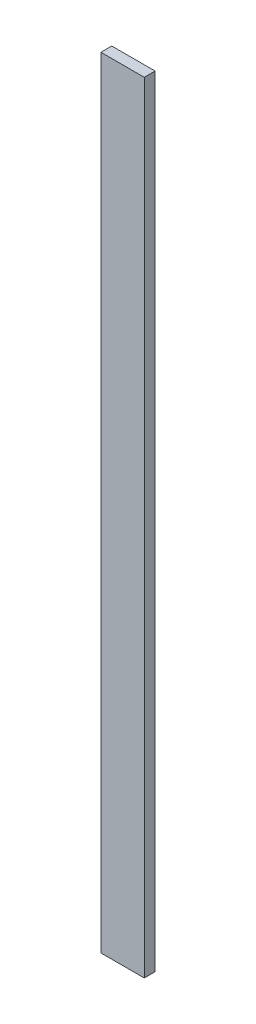
ISO-10303-21;
HEADER;
FILE_DESCRIPTION(('STEP AP214'),'2;1');
FILE_NAME('part.step','',(''),(''),'','','');
FILE_SCHEMA(('AUTOMOTIVE_DESIGN { 1 0 10303 214 1 1 1 1 }'));
ENDSEC;
DATA;
#1=APPLICATION_CONTEXT('core data for automotive mechanical design processes');
#2=APPLICATION_PROTOCOL_DEFINITION('international standard','automotive_design',2000,#1);
#3=PRODUCT_CONTEXT('',#1,'mechanical');
#4=PRODUCT('Part','Part','',(#3));
#5=PRODUCT_RELATED_PRODUCT_CATEGORY('part','',(#4));
#6=PRODUCT_DEFINITION_FORMATION('','',#4);
#7=PRODUCT_DEFINITION_CONTEXT('part definition',#1,'design');
#8=PRODUCT_DEFINITION('design','',#6,#7);
#9=PRODUCT_DEFINITION_SHAPE('','',#8);
#10=(LENGTH_UNIT() NAMED_UNIT(*) SI_UNIT(.MILLI.,.METRE.));
#11=(NAMED_UNIT(*) PLANE_ANGLE_UNIT() SI_UNIT($,.RADIAN.));
#12=(NAMED_UNIT(*) SI_UNIT($,.STERADIAN.) SOLID_ANGLE_UNIT());
#13=UNCERTAINTY_MEASURE_WITH_UNIT(LENGTH_MEASURE(1.E-05),#10,'distance_accuracy_value','');
#14=(GEOMETRIC_REPRESENTATION_CONTEXT(3) GLOBAL_UNCERTAINTY_ASSIGNED_CONTEXT((#13)) GLOBAL_UNIT_ASSIGNED_CONTEXT((#10,
#11,#12)) REPRESENTATION_CONTEXT('',''));
#15=CARTESIAN_POINT('',(0.,0.,0.));
#16=DIRECTION('',(0.,0.,1.));
#17=DIRECTION('',(1.,0.,0.));
#18=AXIS2_PLACEMENT_3D('',#15,#16,#17);
#19=CARTESIAN_POINT('',(12.7,-228.6,6.35));
#20=DIRECTION('',(-1.,0.,0.));
#21=DIRECTION('',(0.,0.,1.));
#22=AXIS2_PLACEMENT_3D('',#19,#20,#21);
#23=PLANE('',#22);
#24=DIRECTION('',(0.,1.,0.));
#25=VECTOR('',#24,1.);
#26=CARTESIAN_POINT('',(12.7,-228.6,0.));
#27=LINE('',#26,#25);
#28=CARTESIAN_POINT('',(12.7,-228.6,0.));
#29=VERTEX_POINT('',#28);
#30=CARTESIAN_POINT('',(12.7,228.6,0.));
#31=VERTEX_POINT('',#30);
#32=EDGE_CURVE('E96',#29,#31,#27,.T.);
#33=ORIENTED_EDGE('',*,*,#32,.T.);
#34=DIRECTION('',(0.,0.,-1.));
#35=VECTOR('',#34,1.);
#36=CARTESIAN_POINT('',(12.7,228.6,6.35));
#37=LINE('',#36,#35);
#38=CARTESIAN_POINT('',(12.7,228.6,6.35));
#39=VERTEX_POINT('',#38);
#40=EDGE_CURVE('E11',#39,#31,#37,.T.);
#41=ORIENTED_EDGE('',*,*,#40,.F.);
#42=DIRECTION('',(0.,1.,0.));
#43=VECTOR('',#42,1.);
#44=CARTESIAN_POINT('',(12.7,-228.6,6.35));
#45=LINE('',#44,#43);
#46=CARTESIAN_POINT('',(12.7,-228.6,6.35));
#47=VERTEX_POINT('',#46);
#48=EDGE_CURVE('E84',#47,#39,#45,.T.);
#49=ORIENTED_EDGE('',*,*,#48,.F.);
#50=DIRECTION('',(0.,0.,-1.));
#51=VECTOR('',#50,1.);
#52=CARTESIAN_POINT('',(12.7,-228.6,6.35));
#53=LINE('',#52,#51);
#54=EDGE_CURVE('E92',#47,#29,#53,.T.);
#55=ORIENTED_EDGE('',*,*,#54,.T.);
#56=EDGE_LOOP('',(#33,#41,#49,#55));
#57=FACE_BOUND('',#56,.T.);
#58=ADVANCED_FACE('F33',(#57),#23,.F.);
#59=CARTESIAN_POINT('',(-12.7,228.6,6.35));
#60=DIRECTION('',(0.,-1.,0.));
#61=DIRECTION('',(0.,0.,-1.));
#62=AXIS2_PLACEMENT_3D('',#59,#60,#61);
#63=PLANE('',#62);
#64=DIRECTION('',(-1.,0.,0.));
#65=VECTOR('',#64,1.);
#66=CARTESIAN_POINT('',(-12.7,228.6,0.));
#67=LINE('',#66,#65);
#68=CARTESIAN_POINT('',(-12.7,228.6,0.));
#69=VERTEX_POINT('',#68);
#70=EDGE_CURVE('E88',#31,#69,#67,.T.);
#71=ORIENTED_EDGE('',*,*,#70,.T.);
#72=DIRECTION('',(0.,0.,-1.));
#73=VECTOR('',#72,1.);
#74=CARTESIAN_POINT('',(-12.7,228.6,6.35));
#75=LINE('',#74,#73);
#76=CARTESIAN_POINT('',(-12.7,228.6,6.35));
#77=VERTEX_POINT('',#76);
#78=EDGE_CURVE('E41',#77,#69,#75,.T.);
#79=ORIENTED_EDGE('',*,*,#78,.F.);
#80=DIRECTION('',(-1.,0.,0.));
#81=VECTOR('',#80,1.);
#82=CARTESIAN_POINT('',(-12.7,228.6,6.35));
#83=LINE('',#82,#81);
#84=EDGE_CURVE('E79',#39,#77,#83,.T.);
#85=ORIENTED_EDGE('',*,*,#84,.F.);
#86=ORIENTED_EDGE('',*,*,#40,.T.);
#87=EDGE_LOOP('',(#71,#79,#85,#86));
#88=FACE_BOUND('',#87,.T.);
#89=ADVANCED_FACE('F87',(#88),#63,.F.);
#90=CARTESIAN_POINT('',(-12.7,-228.6,6.35));
#91=DIRECTION('',(1.,0.,0.));
#92=DIRECTION('',(0.,0.,-1.));
#93=AXIS2_PLACEMENT_3D('',#90,#91,#92);
#94=PLANE('',#93);
#95=DIRECTION('',(0.,-1.,0.));
#96=VECTOR('',#95,1.);
#97=CARTESIAN_POINT('',(-12.7,-228.6,0.));
#98=LINE('',#97,#96);
#99=CARTESIAN_POINT('',(-12.7,-228.6,0.));
#100=VERTEX_POINT('',#99);
#101=EDGE_CURVE('E66',#69,#100,#98,.T.);
#102=ORIENTED_EDGE('',*,*,#101,.T.);
#103=DIRECTION('',(0.,0.,-1.));
#104=VECTOR('',#103,1.);
#105=CARTESIAN_POINT('',(-12.7,-228.6,6.35));
#106=LINE('',#105,#104);
#107=CARTESIAN_POINT('',(-12.7,-228.6,6.35));
#108=VERTEX_POINT('',#107);
#109=EDGE_CURVE('E89',#108,#100,#106,.T.);
#110=ORIENTED_EDGE('',*,*,#109,.F.);
#111=DIRECTION('',(0.,-1.,0.));
#112=VECTOR('',#111,1.);
#113=CARTESIAN_POINT('',(-12.7,-228.6,6.35));
#114=LINE('',#113,#112);
#115=EDGE_CURVE('E82',#77,#108,#114,.T.);
#116=ORIENTED_EDGE('',*,*,#115,.F.);
#117=ORIENTED_EDGE('',*,*,#78,.T.);
#118=EDGE_LOOP('',(#102,#110,#116,#117));
#119=FACE_BOUND('',#118,.T.);
#120=ADVANCED_FACE('F90',(#119),#94,.F.);
#121=CARTESIAN_POINT('',(-12.7,-228.6,6.35));
#122=DIRECTION('',(0.,1.,0.));
#123=DIRECTION('',(0.,0.,1.));
#124=AXIS2_PLACEMENT_3D('',#121,#122,#123);
#125=PLANE('',#124);
#126=DIRECTION('',(1.,0.,0.));
#127=VECTOR('',#126,1.);
#128=CARTESIAN_POINT('',(-12.7,-228.6,0.));
#129=LINE('',#128,#127);
#130=EDGE_CURVE('E72',#100,#29,#129,.T.);
#131=ORIENTED_EDGE('',*,*,#130,.T.);
#132=ORIENTED_EDGE('',*,*,#54,.F.);
#133=DIRECTION('',(1.,0.,0.));
#134=VECTOR('',#133,1.);
#135=CARTESIAN_POINT('',(-12.7,-228.6,6.35));
#136=LINE('',#135,#134);
#137=EDGE_CURVE('E49',#108,#47,#136,.T.);
#138=ORIENTED_EDGE('',*,*,#137,.F.);
#139=ORIENTED_EDGE('',*,*,#109,.T.);
#140=EDGE_LOOP('',(#131,#132,#138,#139));
#141=FACE_BOUND('',#140,.T.);
#142=ADVANCED_FACE('F103',(#141),#125,.F.);
#143=CARTESIAN_POINT('',(0.,0.,6.35));
#144=DIRECTION('',(0.,0.,-1.));
#145=DIRECTION('',(-1.,0.,0.));
#146=AXIS2_PLACEMENT_3D('',#143,#144,#145);
#147=PLANE('',#146);
#148=ORIENTED_EDGE('',*,*,#48,.T.);
#149=ORIENTED_EDGE('',*,*,#84,.T.);
#150=ORIENTED_EDGE('',*,*,#115,.T.);
#151=ORIENTED_EDGE('',*,*,#137,.T.);
#152=EDGE_LOOP('',(#148,#149,#150,#151));
#153=FACE_BOUND('',#152,.T.);
#154=ADVANCED_FACE('F80',(#153),#147,.F.);
#155=CARTESIAN_POINT('',(0.,0.,0.));
#156=DIRECTION('',(0.,0.,-1.));
#157=DIRECTION('',(-1.,0.,0.));
#158=AXIS2_PLACEMENT_3D('',#155,#156,#157);
#159=PLANE('',#158);
#160=ORIENTED_EDGE('',*,*,#32,.F.);
#161=ORIENTED_EDGE('',*,*,#130,.F.);
#162=ORIENTED_EDGE('',*,*,#101,.F.);
#163=ORIENTED_EDGE('',*,*,#70,.F.);
#164=EDGE_LOOP('',(#160,#161,#162,#163));
#165=FACE_BOUND('',#164,.T.);
#166=ADVANCED_FACE('F106',(#165),#159,.T.);
#167=CLOSED_SHELL('',(#58,#89,#120,#142,#154,#166));
#168=MANIFOLD_SOLID_BREP('B2',#167);
#169=ADVANCED_BREP_SHAPE_REPRESENTATION('',(#18,#168),#14);
#170=SHAPE_DEFINITION_REPRESENTATION(#9,#169);
ENDSEC;
END-ISO-10303-21;
